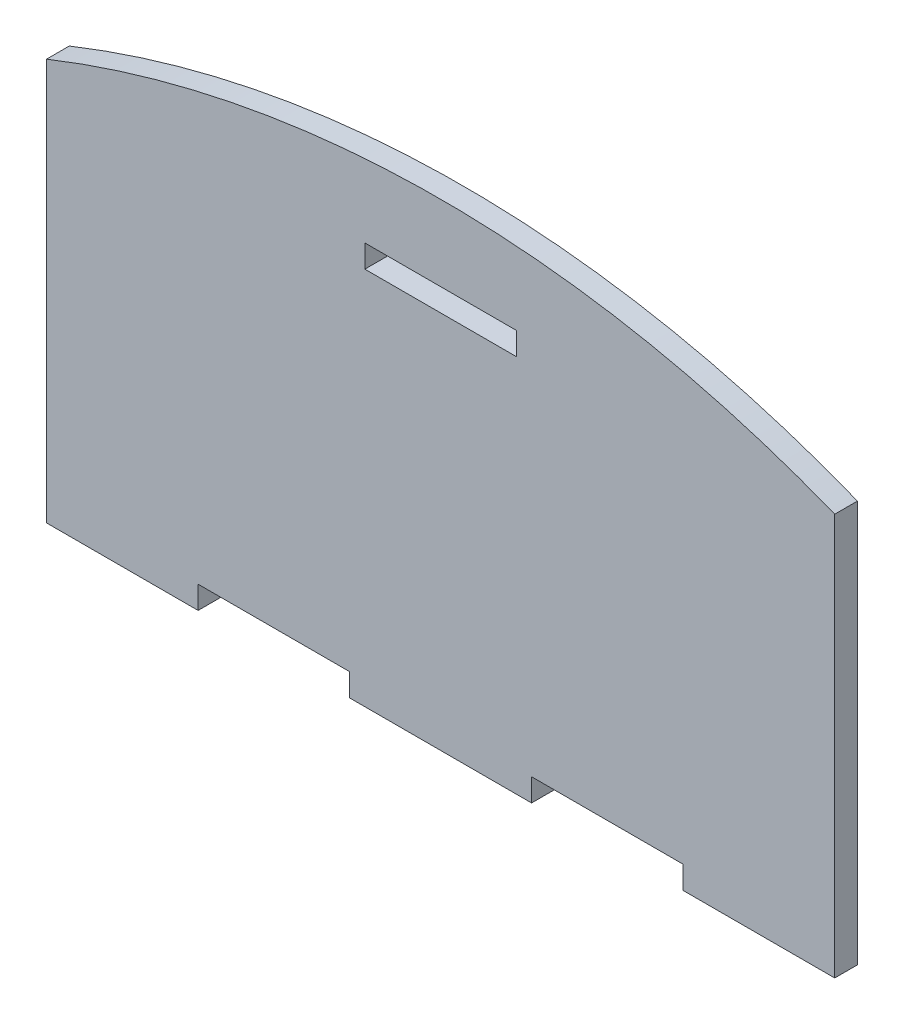
ISO-10303-21;
HEADER;
FILE_DESCRIPTION(('STEP AP214'),'2;1');
FILE_NAME('part.step','',(''),(''),'','','');
FILE_SCHEMA(('AUTOMOTIVE_DESIGN { 1 0 10303 214 1 1 1 1 }'));
ENDSEC;
DATA;
#1=APPLICATION_CONTEXT('core data for automotive mechanical design processes');
#2=APPLICATION_PROTOCOL_DEFINITION('international standard','automotive_design',2000,#1);
#3=PRODUCT_CONTEXT('',#1,'mechanical');
#4=PRODUCT('Part','Part','',(#3));
#5=PRODUCT_RELATED_PRODUCT_CATEGORY('part','',(#4));
#6=PRODUCT_DEFINITION_FORMATION('','',#4);
#7=PRODUCT_DEFINITION_CONTEXT('part definition',#1,'design');
#8=PRODUCT_DEFINITION('design','',#6,#7);
#9=PRODUCT_DEFINITION_SHAPE('','',#8);
#10=(LENGTH_UNIT() NAMED_UNIT(*) SI_UNIT(.MILLI.,.METRE.));
#11=(NAMED_UNIT(*) PLANE_ANGLE_UNIT() SI_UNIT($,.RADIAN.));
#12=(NAMED_UNIT(*) SI_UNIT($,.STERADIAN.) SOLID_ANGLE_UNIT());
#13=UNCERTAINTY_MEASURE_WITH_UNIT(LENGTH_MEASURE(1.E-05),#10,'distance_accuracy_value','');
#14=(GEOMETRIC_REPRESENTATION_CONTEXT(3) GLOBAL_UNCERTAINTY_ASSIGNED_CONTEXT((#13)) GLOBAL_UNIT_ASSIGNED_CONTEXT((#10,
#11,#12)) REPRESENTATION_CONTEXT('',''));
#15=CARTESIAN_POINT('',(0.,0.,0.));
#16=DIRECTION('',(0.,0.,1.));
#17=DIRECTION('',(1.,0.,0.));
#18=AXIS2_PLACEMENT_3D('',#15,#16,#17);
#19=CARTESIAN_POINT('',(22.7578400136184,-102.603689193461,3.));
#20=DIRECTION('',(0.,0.,-1.));
#21=DIRECTION('',(-1.,0.,0.));
#22=AXIS2_PLACEMENT_3D('',#19,#20,#21);
#23=PLANE('',#22);
#24=CARTESIAN_POINT('',(22.7578400136184,-102.603689193461,3.));
#25=DIRECTION('',(0.,0.,1.));
#26=DIRECTION('',(-1.,0.,0.));
#27=AXIS2_PLACEMENT_3D('',#24,#25,#26);
#28=CIRCLE('',#27,140.200000000001);
#29=CARTESIAN_POINT('',(74.7578400136184,27.5963108065403,3.));
#30=VERTEX_POINT('',#29);
#31=CARTESIAN_POINT('',(-29.2421599863816,27.5963108065403,3.));
#32=VERTEX_POINT('',#31);
#33=EDGE_CURVE('E181',#30,#32,#28,.T.);
#34=ORIENTED_EDGE('',*,*,#33,.T.);
#35=DIRECTION('',(0.,-1.,0.));
#36=VECTOR('',#35,1.);
#37=CARTESIAN_POINT('',(-29.2421599863816,27.5963108065403,3.));
#38=LINE('',#37,#36);
#39=CARTESIAN_POINT('',(-29.2421599863816,-25.4036891934597,3.));
#40=VERTEX_POINT('',#39);
#41=EDGE_CURVE('E184',#32,#40,#38,.T.);
#42=ORIENTED_EDGE('',*,*,#41,.T.);
#43=DIRECTION('',(1.,0.,0.));
#44=VECTOR('',#43,1.);
#45=CARTESIAN_POINT('',(-29.2421599863816,-25.4036891934597,3.));
#46=LINE('',#45,#44);
#47=CARTESIAN_POINT('',(-9.24215998638156,-25.4036891934597,3.));
#48=VERTEX_POINT('',#47);
#49=EDGE_CURVE('E187',#40,#48,#46,.T.);
#50=ORIENTED_EDGE('',*,*,#49,.T.);
#51=DIRECTION('',(0.,1.,0.));
#52=VECTOR('',#51,1.);
#53=CARTESIAN_POINT('',(-9.24215998638156,-25.4036891934597,3.));
#54=LINE('',#53,#52);
#55=CARTESIAN_POINT('',(-9.24215998638156,-22.4036891934597,3.));
#56=VERTEX_POINT('',#55);
#57=EDGE_CURVE('E189',#48,#56,#54,.T.);
#58=ORIENTED_EDGE('',*,*,#57,.T.);
#59=DIRECTION('',(1.,0.,0.));
#60=VECTOR('',#59,1.);
#61=CARTESIAN_POINT('',(-9.24215998638156,-22.4036891934597,3.));
#62=LINE('',#61,#60);
#63=CARTESIAN_POINT('',(10.7578400136184,-22.4036891934597,3.));
#64=VERTEX_POINT('',#63);
#65=EDGE_CURVE('E191',#56,#64,#62,.T.);
#66=ORIENTED_EDGE('',*,*,#65,.T.);
#67=DIRECTION('',(0.,-1.,0.));
#68=VECTOR('',#67,1.);
#69=CARTESIAN_POINT('',(10.7578400136184,-22.4036891934597,3.));
#70=LINE('',#69,#68);
#71=CARTESIAN_POINT('',(10.7578400136184,-25.4036891934597,3.));
#72=VERTEX_POINT('',#71);
#73=EDGE_CURVE('E193',#64,#72,#70,.T.);
#74=ORIENTED_EDGE('',*,*,#73,.T.);
#75=DIRECTION('',(1.,0.,0.));
#76=VECTOR('',#75,1.);
#77=CARTESIAN_POINT('',(10.7578400136184,-25.4036891934597,3.));
#78=LINE('',#77,#76);
#79=CARTESIAN_POINT('',(34.7578400136184,-25.4036891934597,3.));
#80=VERTEX_POINT('',#79);
#81=EDGE_CURVE('E195',#72,#80,#78,.T.);
#82=ORIENTED_EDGE('',*,*,#81,.T.);
#83=DIRECTION('',(0.,1.,0.));
#84=VECTOR('',#83,1.);
#85=CARTESIAN_POINT('',(34.7578400136184,-25.4036891934597,3.));
#86=LINE('',#85,#84);
#87=CARTESIAN_POINT('',(34.7578400136184,-22.4036891934597,3.));
#88=VERTEX_POINT('',#87);
#89=EDGE_CURVE('E197',#80,#88,#86,.T.);
#90=ORIENTED_EDGE('',*,*,#89,.T.);
#91=DIRECTION('',(1.,0.,0.));
#92=VECTOR('',#91,1.);
#93=CARTESIAN_POINT('',(34.7578400136184,-22.4036891934597,3.));
#94=LINE('',#93,#92);
#95=CARTESIAN_POINT('',(54.7578400136184,-22.4036891934597,3.));
#96=VERTEX_POINT('',#95);
#97=EDGE_CURVE('E199',#88,#96,#94,.T.);
#98=ORIENTED_EDGE('',*,*,#97,.T.);
#99=DIRECTION('',(0.,-1.,0.));
#100=VECTOR('',#99,1.);
#101=CARTESIAN_POINT('',(54.7578400136184,-22.4036891934597,3.));
#102=LINE('',#101,#100);
#103=CARTESIAN_POINT('',(54.7578400136184,-25.4036891934597,3.));
#104=VERTEX_POINT('',#103);
#105=EDGE_CURVE('E201',#96,#104,#102,.T.);
#106=ORIENTED_EDGE('',*,*,#105,.T.);
#107=DIRECTION('',(1.,0.,0.));
#108=VECTOR('',#107,1.);
#109=CARTESIAN_POINT('',(54.7578400136184,-25.4036891934597,3.));
#110=LINE('',#109,#108);
#111=CARTESIAN_POINT('',(74.7578400136184,-25.4036891934597,3.));
#112=VERTEX_POINT('',#111);
#113=EDGE_CURVE('E203',#104,#112,#110,.T.);
#114=ORIENTED_EDGE('',*,*,#113,.T.);
#115=DIRECTION('',(0.,1.,0.));
#116=VECTOR('',#115,1.);
#117=CARTESIAN_POINT('',(74.7578400136184,27.5963108065403,3.));
#118=LINE('',#117,#116);
#119=EDGE_CURVE('E205',#112,#30,#118,.T.);
#120=ORIENTED_EDGE('',*,*,#119,.T.);
#121=EDGE_LOOP('',(#34,#42,#50,#58,#66,#74,#82,#90,#98,#106,#114,#120));
#122=FACE_BOUND('',#121,.T.);
#123=DIRECTION('',(0.,1.,0.));
#124=VECTOR('',#123,1.);
#125=CARTESIAN_POINT('',(32.7578400136184,24.5963108065403,3.));
#126=LINE('',#125,#124);
#127=CARTESIAN_POINT('',(32.7578400136184,24.5963108065403,3.));
#128=VERTEX_POINT('',#127);
#129=CARTESIAN_POINT('',(32.7578400136184,27.5963108065403,3.));
#130=VERTEX_POINT('',#129);
#131=EDGE_CURVE('E145',#128,#130,#126,.T.);
#132=ORIENTED_EDGE('',*,*,#131,.F.);
#133=DIRECTION('',(1.,0.,0.));
#134=VECTOR('',#133,1.);
#135=CARTESIAN_POINT('',(12.7578400136184,24.5963108065403,3.));
#136=LINE('',#135,#134);
#137=CARTESIAN_POINT('',(12.7578400136184,24.5963108065403,3.));
#138=VERTEX_POINT('',#137);
#139=EDGE_CURVE('E167',#138,#128,#136,.T.);
#140=ORIENTED_EDGE('',*,*,#139,.F.);
#141=DIRECTION('',(0.,-1.,0.));
#142=VECTOR('',#141,1.);
#143=CARTESIAN_POINT('',(12.7578400136184,24.5963108065403,3.));
#144=LINE('',#143,#142);
#145=CARTESIAN_POINT('',(12.7578400136184,27.5963108065403,3.));
#146=VERTEX_POINT('',#145);
#147=EDGE_CURVE('E165',#146,#138,#144,.T.);
#148=ORIENTED_EDGE('',*,*,#147,.F.);
#149=DIRECTION('',(-1.,0.,0.));
#150=VECTOR('',#149,1.);
#151=CARTESIAN_POINT('',(12.7578400136184,27.5963108065403,3.));
#152=LINE('',#151,#150);
#153=EDGE_CURVE('E153',#130,#146,#152,.T.);
#154=ORIENTED_EDGE('',*,*,#153,.F.);
#155=EDGE_LOOP('',(#132,#140,#148,#154));
#156=FACE_BOUND('',#155,.T.);
#157=ADVANCED_FACE('F32',(#122,#156),#23,.F.);
#158=CARTESIAN_POINT('',(22.7578400136184,-102.603689193461,0.));
#159=DIRECTION('',(0.,0.,-1.));
#160=DIRECTION('',(-1.,0.,0.));
#161=AXIS2_PLACEMENT_3D('',#158,#159,#160);
#162=PLANE('',#161);
#163=CARTESIAN_POINT('',(22.7578400136184,-102.603689193461,0.));
#164=DIRECTION('',(0.,0.,1.));
#165=DIRECTION('',(-1.,0.,0.));
#166=AXIS2_PLACEMENT_3D('',#163,#164,#165);
#167=CIRCLE('',#166,140.200000000001);
#168=CARTESIAN_POINT('',(74.7578400136184,27.5963108065403,0.));
#169=VERTEX_POINT('',#168);
#170=CARTESIAN_POINT('',(-29.2421599863816,27.5963108065403,0.));
#171=VERTEX_POINT('',#170);
#172=EDGE_CURVE('E161',#169,#171,#167,.T.);
#173=ORIENTED_EDGE('',*,*,#172,.F.);
#174=DIRECTION('',(0.,1.,0.));
#175=VECTOR('',#174,1.);
#176=CARTESIAN_POINT('',(74.7578400136184,27.5963108065403,0.));
#177=LINE('',#176,#175);
#178=CARTESIAN_POINT('',(74.7578400136184,-25.4036891934597,0.));
#179=VERTEX_POINT('',#178);
#180=EDGE_CURVE('E185',#179,#169,#177,.T.);
#181=ORIENTED_EDGE('',*,*,#180,.F.);
#182=DIRECTION('',(1.,0.,0.));
#183=VECTOR('',#182,1.);
#184=CARTESIAN_POINT('',(54.7578400136184,-25.4036891934597,0.));
#185=LINE('',#184,#183);
#186=CARTESIAN_POINT('',(54.7578400136184,-25.4036891934597,0.));
#187=VERTEX_POINT('',#186);
#188=EDGE_CURVE('E228',#187,#179,#185,.T.);
#189=ORIENTED_EDGE('',*,*,#188,.F.);
#190=DIRECTION('',(0.,-1.,0.));
#191=VECTOR('',#190,1.);
#192=CARTESIAN_POINT('',(54.7578400136184,-22.4036891934597,0.));
#193=LINE('',#192,#191);
#194=CARTESIAN_POINT('',(54.7578400136184,-22.4036891934597,0.));
#195=VERTEX_POINT('',#194);
#196=EDGE_CURVE('E226',#195,#187,#193,.T.);
#197=ORIENTED_EDGE('',*,*,#196,.F.);
#198=DIRECTION('',(1.,0.,0.));
#199=VECTOR('',#198,1.);
#200=CARTESIAN_POINT('',(34.7578400136184,-22.4036891934597,0.));
#201=LINE('',#200,#199);
#202=CARTESIAN_POINT('',(34.7578400136184,-22.4036891934597,0.));
#203=VERTEX_POINT('',#202);
#204=EDGE_CURVE('E224',#203,#195,#201,.T.);
#205=ORIENTED_EDGE('',*,*,#204,.F.);
#206=DIRECTION('',(0.,1.,0.));
#207=VECTOR('',#206,1.);
#208=CARTESIAN_POINT('',(34.7578400136184,-25.4036891934597,0.));
#209=LINE('',#208,#207);
#210=CARTESIAN_POINT('',(34.7578400136184,-25.4036891934597,0.));
#211=VERTEX_POINT('',#210);
#212=EDGE_CURVE('E222',#211,#203,#209,.T.);
#213=ORIENTED_EDGE('',*,*,#212,.F.);
#214=DIRECTION('',(1.,0.,0.));
#215=VECTOR('',#214,1.);
#216=CARTESIAN_POINT('',(10.7578400136184,-25.4036891934597,0.));
#217=LINE('',#216,#215);
#218=CARTESIAN_POINT('',(10.7578400136184,-25.4036891934597,0.));
#219=VERTEX_POINT('',#218);
#220=EDGE_CURVE('E220',#219,#211,#217,.T.);
#221=ORIENTED_EDGE('',*,*,#220,.F.);
#222=DIRECTION('',(0.,-1.,0.));
#223=VECTOR('',#222,1.);
#224=CARTESIAN_POINT('',(10.7578400136184,-22.4036891934597,0.));
#225=LINE('',#224,#223);
#226=CARTESIAN_POINT('',(10.7578400136184,-22.4036891934597,0.));
#227=VERTEX_POINT('',#226);
#228=EDGE_CURVE('E218',#227,#219,#225,.T.);
#229=ORIENTED_EDGE('',*,*,#228,.F.);
#230=DIRECTION('',(1.,0.,0.));
#231=VECTOR('',#230,1.);
#232=CARTESIAN_POINT('',(-9.24215998638156,-22.4036891934597,0.));
#233=LINE('',#232,#231);
#234=CARTESIAN_POINT('',(-9.24215998638156,-22.4036891934597,0.));
#235=VERTEX_POINT('',#234);
#236=EDGE_CURVE('E216',#235,#227,#233,.T.);
#237=ORIENTED_EDGE('',*,*,#236,.F.);
#238=DIRECTION('',(0.,1.,0.));
#239=VECTOR('',#238,1.);
#240=CARTESIAN_POINT('',(-9.24215998638156,-25.4036891934597,0.));
#241=LINE('',#240,#239);
#242=CARTESIAN_POINT('',(-9.24215998638156,-25.4036891934597,0.));
#243=VERTEX_POINT('',#242);
#244=EDGE_CURVE('E214',#243,#235,#241,.T.);
#245=ORIENTED_EDGE('',*,*,#244,.F.);
#246=DIRECTION('',(1.,0.,0.));
#247=VECTOR('',#246,1.);
#248=CARTESIAN_POINT('',(-29.2421599863816,-25.4036891934597,0.));
#249=LINE('',#248,#247);
#250=CARTESIAN_POINT('',(-29.2421599863816,-25.4036891934597,0.));
#251=VERTEX_POINT('',#250);
#252=EDGE_CURVE('E212',#251,#243,#249,.T.);
#253=ORIENTED_EDGE('',*,*,#252,.F.);
#254=DIRECTION('',(0.,-1.,0.));
#255=VECTOR('',#254,1.);
#256=CARTESIAN_POINT('',(-29.2421599863816,27.5963108065403,0.));
#257=LINE('',#256,#255);
#258=EDGE_CURVE('E210',#171,#251,#257,.T.);
#259=ORIENTED_EDGE('',*,*,#258,.F.);
#260=EDGE_LOOP('',(#173,#181,#189,#197,#205,#213,#221,#229,#237,#245,#253,#259));
#261=FACE_BOUND('',#260,.T.);
#262=DIRECTION('',(1.,0.,0.));
#263=VECTOR('',#262,1.);
#264=CARTESIAN_POINT('',(12.7578400136184,24.5963108065403,0.));
#265=LINE('',#264,#263);
#266=CARTESIAN_POINT('',(12.7578400136184,24.5963108065403,0.));
#267=VERTEX_POINT('',#266);
#268=CARTESIAN_POINT('',(32.7578400136184,24.5963108065403,0.));
#269=VERTEX_POINT('',#268);
#270=EDGE_CURVE('E154',#267,#269,#265,.T.);
#271=ORIENTED_EDGE('',*,*,#270,.T.);
#272=DIRECTION('',(0.,1.,0.));
#273=VECTOR('',#272,1.);
#274=CARTESIAN_POINT('',(32.7578400136184,24.5963108065403,0.));
#275=LINE('',#274,#273);
#276=CARTESIAN_POINT('',(32.7578400136184,27.5963108065403,0.));
#277=VERTEX_POINT('',#276);
#278=EDGE_CURVE('E55',#269,#277,#275,.T.);
#279=ORIENTED_EDGE('',*,*,#278,.T.);
#280=DIRECTION('',(-1.,0.,0.));
#281=VECTOR('',#280,1.);
#282=CARTESIAN_POINT('',(12.7578400136184,27.5963108065403,0.));
#283=LINE('',#282,#281);
#284=CARTESIAN_POINT('',(12.7578400136184,27.5963108065403,0.));
#285=VERTEX_POINT('',#284);
#286=EDGE_CURVE('E160',#277,#285,#283,.T.);
#287=ORIENTED_EDGE('',*,*,#286,.T.);
#288=DIRECTION('',(0.,-1.,0.));
#289=VECTOR('',#288,1.);
#290=CARTESIAN_POINT('',(12.7578400136184,24.5963108065403,0.));
#291=LINE('',#290,#289);
#292=EDGE_CURVE('E173',#285,#267,#291,.T.);
#293=ORIENTED_EDGE('',*,*,#292,.T.);
#294=EDGE_LOOP('',(#271,#279,#287,#293));
#295=FACE_BOUND('',#294,.T.);
#296=ADVANCED_FACE('F270',(#261,#295),#162,.T.);
#297=CARTESIAN_POINT('',(22.7578400136184,-102.603689193461,3.));
#298=DIRECTION('',(0.,0.,-1.));
#299=DIRECTION('',(-1.,0.,0.));
#300=AXIS2_PLACEMENT_3D('',#297,#298,#299);
#301=CYLINDRICAL_SURFACE('',#300,140.200000000001);
#302=ORIENTED_EDGE('',*,*,#172,.T.);
#303=DIRECTION('',(0.,0.,-1.));
#304=VECTOR('',#303,1.);
#305=CARTESIAN_POINT('',(-29.2421599863816,27.5963108065403,3.));
#306=LINE('',#305,#304);
#307=EDGE_CURVE('E11',#32,#171,#306,.T.);
#308=ORIENTED_EDGE('',*,*,#307,.F.);
#309=ORIENTED_EDGE('',*,*,#33,.F.);
#310=DIRECTION('',(0.,0.,-1.));
#311=VECTOR('',#310,1.);
#312=CARTESIAN_POINT('',(74.7578400136184,27.5963108065403,3.));
#313=LINE('',#312,#311);
#314=EDGE_CURVE('E207',#30,#169,#313,.T.);
#315=ORIENTED_EDGE('',*,*,#314,.T.);
#316=EDGE_LOOP('',(#302,#308,#309,#315));
#317=FACE_BOUND('',#316,.T.);
#318=ADVANCED_FACE('F34',(#317),#301,.T.);
#319=CARTESIAN_POINT('',(-29.2421599863816,27.5963108065403,3.));
#320=DIRECTION('',(1.,0.,0.));
#321=DIRECTION('',(0.,1.,0.));
#322=AXIS2_PLACEMENT_3D('',#319,#320,#321);
#323=PLANE('',#322);
#324=ORIENTED_EDGE('',*,*,#258,.T.);
#325=DIRECTION('',(0.,0.,-1.));
#326=VECTOR('',#325,1.);
#327=CARTESIAN_POINT('',(-29.2421599863816,-25.4036891934597,3.));
#328=LINE('',#327,#326);
#329=EDGE_CURVE('E40',#40,#251,#328,.T.);
#330=ORIENTED_EDGE('',*,*,#329,.F.);
#331=ORIENTED_EDGE('',*,*,#41,.F.);
#332=ORIENTED_EDGE('',*,*,#307,.T.);
#333=EDGE_LOOP('',(#324,#330,#331,#332));
#334=FACE_BOUND('',#333,.T.);
#335=ADVANCED_FACE('F287',(#334),#323,.F.);
#336=CARTESIAN_POINT('',(-29.2421599863816,-25.4036891934597,3.));
#337=DIRECTION('',(0.,1.,0.));
#338=DIRECTION('',(0.,0.,1.));
#339=AXIS2_PLACEMENT_3D('',#336,#337,#338);
#340=PLANE('',#339);
#341=ORIENTED_EDGE('',*,*,#252,.T.);
#342=DIRECTION('',(0.,0.,-1.));
#343=VECTOR('',#342,1.);
#344=CARTESIAN_POINT('',(-9.24215998638156,-25.4036891934597,3.));
#345=LINE('',#344,#343);
#346=EDGE_CURVE('E257',#48,#243,#345,.T.);
#347=ORIENTED_EDGE('',*,*,#346,.F.);
#348=ORIENTED_EDGE('',*,*,#49,.F.);
#349=ORIENTED_EDGE('',*,*,#329,.T.);
#350=EDGE_LOOP('',(#341,#347,#348,#349));
#351=FACE_BOUND('',#350,.T.);
#352=ADVANCED_FACE('F264',(#351),#340,.F.);
#353=CARTESIAN_POINT('',(-9.24215998638156,-25.4036891934597,3.));
#354=DIRECTION('',(-1.,0.,0.));
#355=DIRECTION('',(0.,0.,1.));
#356=AXIS2_PLACEMENT_3D('',#353,#354,#355);
#357=PLANE('',#356);
#358=ORIENTED_EDGE('',*,*,#244,.T.);
#359=DIRECTION('',(0.,0.,-1.));
#360=VECTOR('',#359,1.);
#361=CARTESIAN_POINT('',(-9.24215998638156,-22.4036891934597,3.));
#362=LINE('',#361,#360);
#363=EDGE_CURVE('E254',#56,#235,#362,.T.);
#364=ORIENTED_EDGE('',*,*,#363,.F.);
#365=ORIENTED_EDGE('',*,*,#57,.F.);
#366=ORIENTED_EDGE('',*,*,#346,.T.);
#367=EDGE_LOOP('',(#358,#364,#365,#366));
#368=FACE_BOUND('',#367,.T.);
#369=ADVANCED_FACE('F276',(#368),#357,.F.);
#370=CARTESIAN_POINT('',(-9.24215998638156,-22.4036891934597,3.));
#371=DIRECTION('',(0.,1.,0.));
#372=DIRECTION('',(-1.,0.,0.));
#373=AXIS2_PLACEMENT_3D('',#370,#371,#372);
#374=PLANE('',#373);
#375=ORIENTED_EDGE('',*,*,#236,.T.);
#376=DIRECTION('',(0.,0.,-1.));
#377=VECTOR('',#376,1.);
#378=CARTESIAN_POINT('',(10.7578400136184,-22.4036891934597,3.));
#379=LINE('',#378,#377);
#380=EDGE_CURVE('E251',#64,#227,#379,.T.);
#381=ORIENTED_EDGE('',*,*,#380,.F.);
#382=ORIENTED_EDGE('',*,*,#65,.F.);
#383=ORIENTED_EDGE('',*,*,#363,.T.);
#384=EDGE_LOOP('',(#375,#381,#382,#383));
#385=FACE_BOUND('',#384,.T.);
#386=ADVANCED_FACE('F280',(#385),#374,.F.);
#387=CARTESIAN_POINT('',(10.7578400136184,-22.4036891934597,3.));
#388=DIRECTION('',(1.,0.,0.));
#389=DIRECTION('',(0.,0.,-1.));
#390=AXIS2_PLACEMENT_3D('',#387,#388,#389);
#391=PLANE('',#390);
#392=ORIENTED_EDGE('',*,*,#228,.T.);
#393=DIRECTION('',(0.,0.,-1.));
#394=VECTOR('',#393,1.);
#395=CARTESIAN_POINT('',(10.7578400136184,-25.4036891934597,3.));
#396=LINE('',#395,#394);
#397=EDGE_CURVE('E248',#72,#219,#396,.T.);
#398=ORIENTED_EDGE('',*,*,#397,.F.);
#399=ORIENTED_EDGE('',*,*,#73,.F.);
#400=ORIENTED_EDGE('',*,*,#380,.T.);
#401=EDGE_LOOP('',(#392,#398,#399,#400));
#402=FACE_BOUND('',#401,.T.);
#403=ADVANCED_FACE('F320',(#402),#391,.F.);
#404=CARTESIAN_POINT('',(10.7578400136184,-25.4036891934597,3.));
#405=DIRECTION('',(0.,1.,0.));
#406=DIRECTION('',(0.,0.,1.));
#407=AXIS2_PLACEMENT_3D('',#404,#405,#406);
#408=PLANE('',#407);
#409=ORIENTED_EDGE('',*,*,#220,.T.);
#410=DIRECTION('',(0.,0.,-1.));
#411=VECTOR('',#410,1.);
#412=CARTESIAN_POINT('',(34.7578400136184,-25.4036891934597,3.));
#413=LINE('',#412,#411);
#414=EDGE_CURVE('E245',#80,#211,#413,.T.);
#415=ORIENTED_EDGE('',*,*,#414,.F.);
#416=ORIENTED_EDGE('',*,*,#81,.F.);
#417=ORIENTED_EDGE('',*,*,#397,.T.);
#418=EDGE_LOOP('',(#409,#415,#416,#417));
#419=FACE_BOUND('',#418,.T.);
#420=ADVANCED_FACE('F318',(#419),#408,.F.);
#421=CARTESIAN_POINT('',(34.7578400136184,-25.4036891934597,3.));
#422=DIRECTION('',(-1.,0.,0.));
#423=DIRECTION('',(0.,0.,1.));
#424=AXIS2_PLACEMENT_3D('',#421,#422,#423);
#425=PLANE('',#424);
#426=ORIENTED_EDGE('',*,*,#212,.T.);
#427=DIRECTION('',(0.,0.,-1.));
#428=VECTOR('',#427,1.);
#429=CARTESIAN_POINT('',(34.7578400136184,-22.4036891934597,3.));
#430=LINE('',#429,#428);
#431=EDGE_CURVE('E242',#88,#203,#430,.T.);
#432=ORIENTED_EDGE('',*,*,#431,.F.);
#433=ORIENTED_EDGE('',*,*,#89,.F.);
#434=ORIENTED_EDGE('',*,*,#414,.T.);
#435=EDGE_LOOP('',(#426,#432,#433,#434));
#436=FACE_BOUND('',#435,.T.);
#437=ADVANCED_FACE('F314',(#436),#425,.F.);
#438=CARTESIAN_POINT('',(34.7578400136184,-22.4036891934597,3.));
#439=DIRECTION('',(0.,1.,0.));
#440=DIRECTION('',(0.,0.,1.));
#441=AXIS2_PLACEMENT_3D('',#438,#439,#440);
#442=PLANE('',#441);
#443=ORIENTED_EDGE('',*,*,#204,.T.);
#444=DIRECTION('',(0.,0.,-1.));
#445=VECTOR('',#444,1.);
#446=CARTESIAN_POINT('',(54.7578400136184,-22.4036891934597,3.));
#447=LINE('',#446,#445);
#448=EDGE_CURVE('E239',#96,#195,#447,.T.);
#449=ORIENTED_EDGE('',*,*,#448,.F.);
#450=ORIENTED_EDGE('',*,*,#97,.F.);
#451=ORIENTED_EDGE('',*,*,#431,.T.);
#452=EDGE_LOOP('',(#443,#449,#450,#451));
#453=FACE_BOUND('',#452,.T.);
#454=ADVANCED_FACE('F309',(#453),#442,.F.);
#455=CARTESIAN_POINT('',(54.7578400136184,-22.4036891934597,3.));
#456=DIRECTION('',(1.,0.,0.));
#457=DIRECTION('',(0.,0.,-1.));
#458=AXIS2_PLACEMENT_3D('',#455,#456,#457);
#459=PLANE('',#458);
#460=ORIENTED_EDGE('',*,*,#196,.T.);
#461=DIRECTION('',(0.,0.,-1.));
#462=VECTOR('',#461,1.);
#463=CARTESIAN_POINT('',(54.7578400136184,-25.4036891934597,3.));
#464=LINE('',#463,#462);
#465=EDGE_CURVE('E236',#104,#187,#464,.T.);
#466=ORIENTED_EDGE('',*,*,#465,.F.);
#467=ORIENTED_EDGE('',*,*,#105,.F.);
#468=ORIENTED_EDGE('',*,*,#448,.T.);
#469=EDGE_LOOP('',(#460,#466,#467,#468));
#470=FACE_BOUND('',#469,.T.);
#471=ADVANCED_FACE('F303',(#470),#459,.F.);
#472=CARTESIAN_POINT('',(54.7578400136184,-25.4036891934597,3.));
#473=DIRECTION('',(0.,1.,0.));
#474=DIRECTION('',(0.,0.,1.));
#475=AXIS2_PLACEMENT_3D('',#472,#473,#474);
#476=PLANE('',#475);
#477=ORIENTED_EDGE('',*,*,#188,.T.);
#478=DIRECTION('',(0.,0.,-1.));
#479=VECTOR('',#478,1.);
#480=CARTESIAN_POINT('',(74.7578400136184,-25.4036891934597,3.));
#481=LINE('',#480,#479);
#482=EDGE_CURVE('E233',#112,#179,#481,.T.);
#483=ORIENTED_EDGE('',*,*,#482,.F.);
#484=ORIENTED_EDGE('',*,*,#113,.F.);
#485=ORIENTED_EDGE('',*,*,#465,.T.);
#486=EDGE_LOOP('',(#477,#483,#484,#485));
#487=FACE_BOUND('',#486,.T.);
#488=ADVANCED_FACE('F299',(#487),#476,.F.);
#489=CARTESIAN_POINT('',(74.7578400136184,27.5963108065403,3.));
#490=DIRECTION('',(-1.,0.,0.));
#491=DIRECTION('',(0.,0.,1.));
#492=AXIS2_PLACEMENT_3D('',#489,#490,#491);
#493=PLANE('',#492);
#494=ORIENTED_EDGE('',*,*,#180,.T.);
#495=ORIENTED_EDGE('',*,*,#314,.F.);
#496=ORIENTED_EDGE('',*,*,#119,.F.);
#497=ORIENTED_EDGE('',*,*,#482,.T.);
#498=EDGE_LOOP('',(#494,#495,#496,#497));
#499=FACE_BOUND('',#498,.T.);
#500=ADVANCED_FACE('F294',(#499),#493,.F.);
#501=CARTESIAN_POINT('',(32.7578400136184,24.5963108065403,3.));
#502=DIRECTION('',(-1.,0.,0.));
#503=DIRECTION('',(0.,0.,1.));
#504=AXIS2_PLACEMENT_3D('',#501,#502,#503);
#505=PLANE('',#504);
#506=ORIENTED_EDGE('',*,*,#278,.F.);
#507=DIRECTION('',(0.,0.,-1.));
#508=VECTOR('',#507,1.);
#509=CARTESIAN_POINT('',(32.7578400136184,24.5963108065403,3.));
#510=LINE('',#509,#508);
#511=EDGE_CURVE('E149',#128,#269,#510,.T.);
#512=ORIENTED_EDGE('',*,*,#511,.F.);
#513=ORIENTED_EDGE('',*,*,#131,.T.);
#514=DIRECTION('',(0.,0.,-1.));
#515=VECTOR('',#514,1.);
#516=CARTESIAN_POINT('',(32.7578400136184,27.5963108065403,3.));
#517=LINE('',#516,#515);
#518=EDGE_CURVE('E148',#130,#277,#517,.T.);
#519=ORIENTED_EDGE('',*,*,#518,.T.);
#520=EDGE_LOOP('',(#506,#512,#513,#519));
#521=FACE_BOUND('',#520,.T.);
#522=ADVANCED_FACE('F147',(#521),#505,.T.);
#523=CARTESIAN_POINT('',(12.7578400136184,27.5963108065403,3.));
#524=DIRECTION('',(0.,-1.,0.));
#525=DIRECTION('',(0.,0.,-1.));
#526=AXIS2_PLACEMENT_3D('',#523,#524,#525);
#527=PLANE('',#526);
#528=ORIENTED_EDGE('',*,*,#286,.F.);
#529=ORIENTED_EDGE('',*,*,#518,.F.);
#530=ORIENTED_EDGE('',*,*,#153,.T.);
#531=DIRECTION('',(0.,0.,-1.));
#532=VECTOR('',#531,1.);
#533=CARTESIAN_POINT('',(12.7578400136184,27.5963108065403,3.));
#534=LINE('',#533,#532);
#535=EDGE_CURVE('E162',#146,#285,#534,.T.);
#536=ORIENTED_EDGE('',*,*,#535,.T.);
#537=EDGE_LOOP('',(#528,#529,#530,#536));
#538=FACE_BOUND('',#537,.T.);
#539=ADVANCED_FACE('F157',(#538),#527,.T.);
#540=CARTESIAN_POINT('',(12.7578400136184,24.5963108065403,3.));
#541=DIRECTION('',(1.,0.,0.));
#542=DIRECTION('',(0.,0.,-1.));
#543=AXIS2_PLACEMENT_3D('',#540,#541,#542);
#544=PLANE('',#543);
#545=ORIENTED_EDGE('',*,*,#292,.F.);
#546=ORIENTED_EDGE('',*,*,#535,.F.);
#547=ORIENTED_EDGE('',*,*,#147,.T.);
#548=DIRECTION('',(0.,0.,-1.));
#549=VECTOR('',#548,1.);
#550=CARTESIAN_POINT('',(12.7578400136184,24.5963108065403,3.));
#551=LINE('',#550,#549);
#552=EDGE_CURVE('E47',#138,#267,#551,.T.);
#553=ORIENTED_EDGE('',*,*,#552,.T.);
#554=EDGE_LOOP('',(#545,#546,#547,#553));
#555=FACE_BOUND('',#554,.T.);
#556=ADVANCED_FACE('F378',(#555),#544,.T.);
#557=CARTESIAN_POINT('',(12.7578400136184,24.5963108065403,3.));
#558=DIRECTION('',(0.,1.,0.));
#559=DIRECTION('',(0.,0.,1.));
#560=AXIS2_PLACEMENT_3D('',#557,#558,#559);
#561=PLANE('',#560);
#562=ORIENTED_EDGE('',*,*,#270,.F.);
#563=ORIENTED_EDGE('',*,*,#552,.F.);
#564=ORIENTED_EDGE('',*,*,#139,.T.);
#565=ORIENTED_EDGE('',*,*,#511,.T.);
#566=EDGE_LOOP('',(#562,#563,#564,#565));
#567=FACE_BOUND('',#566,.T.);
#568=ADVANCED_FACE('F384',(#567),#561,.T.);
#569=CLOSED_SHELL('',(#157,#296,#318,#335,#352,#369,#386,#403,#420,#437,#454,#471,#488,#500,
#522,#539,#556,#568));
#570=MANIFOLD_SOLID_BREP('B2',#569);
#571=ADVANCED_BREP_SHAPE_REPRESENTATION('',(#18,#570),#14);
#572=SHAPE_DEFINITION_REPRESENTATION(#9,#571);
ENDSEC;
END-ISO-10303-21;
